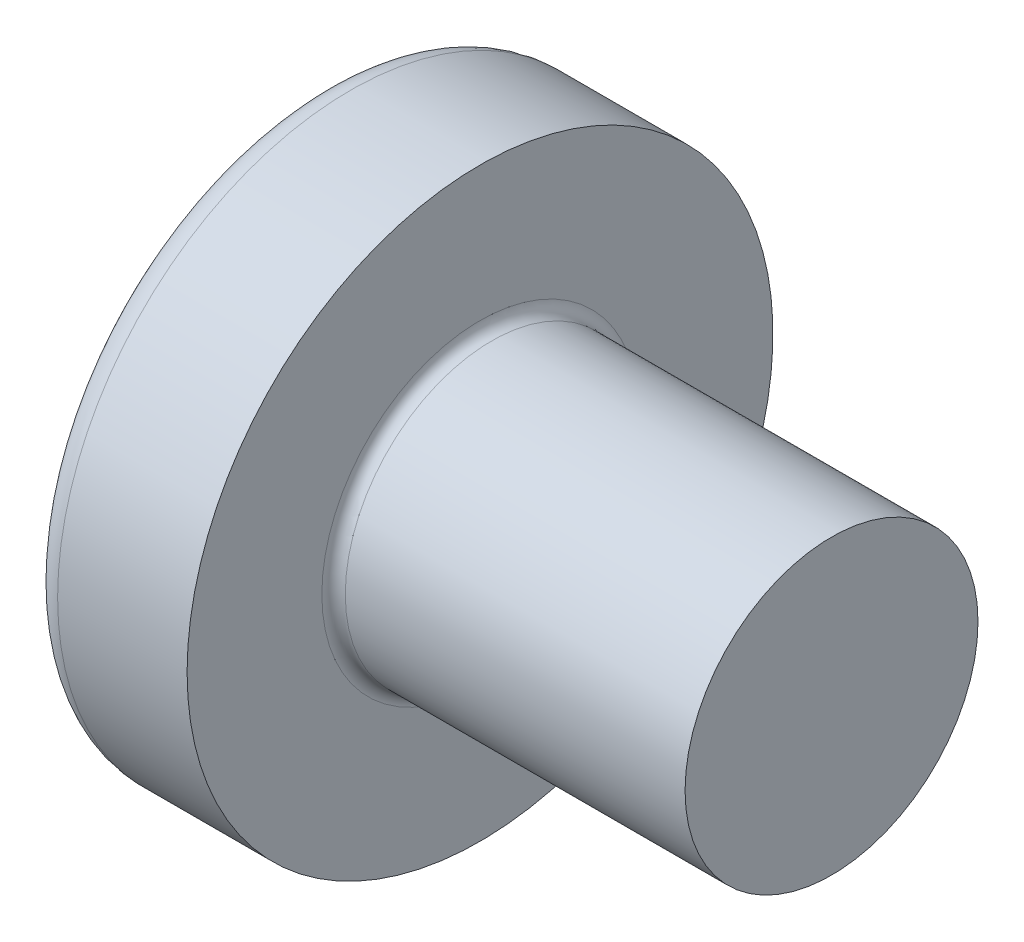
ISO-10303-21;
HEADER;
FILE_DESCRIPTION(('STEP AP214'),'2;1');
FILE_NAME('part.step','',(''),(''),'','','');
FILE_SCHEMA(('AUTOMOTIVE_DESIGN { 1 0 10303 214 1 1 1 1 }'));
ENDSEC;
DATA;
#1=APPLICATION_CONTEXT('core data for automotive mechanical design processes');
#2=APPLICATION_PROTOCOL_DEFINITION('international standard','automotive_design',2000,#1);
#3=PRODUCT_CONTEXT('',#1,'mechanical');
#4=PRODUCT('Part','Part','',(#3));
#5=PRODUCT_RELATED_PRODUCT_CATEGORY('part','',(#4));
#6=PRODUCT_DEFINITION_FORMATION('','',#4);
#7=PRODUCT_DEFINITION_CONTEXT('part definition',#1,'design');
#8=PRODUCT_DEFINITION('design','',#6,#7);
#9=PRODUCT_DEFINITION_SHAPE('','',#8);
#10=(LENGTH_UNIT() NAMED_UNIT(*) SI_UNIT(.MILLI.,.METRE.));
#11=(NAMED_UNIT(*) PLANE_ANGLE_UNIT() SI_UNIT($,.RADIAN.));
#12=(NAMED_UNIT(*) SI_UNIT($,.STERADIAN.) SOLID_ANGLE_UNIT());
#13=UNCERTAINTY_MEASURE_WITH_UNIT(LENGTH_MEASURE(1.E-05),#10,'distance_accuracy_value','');
#14=(GEOMETRIC_REPRESENTATION_CONTEXT(3) GLOBAL_UNCERTAINTY_ASSIGNED_CONTEXT((#13)) GLOBAL_UNIT_ASSIGNED_CONTEXT((#10,
#11,#12)) REPRESENTATION_CONTEXT('',''));
#15=CARTESIAN_POINT('',(0.,0.,0.));
#16=DIRECTION('',(0.,0.,1.));
#17=DIRECTION('',(1.,0.,0.));
#18=AXIS2_PLACEMENT_3D('',#15,#16,#17);
#19=CARTESIAN_POINT('',(4.,0.,0.));
#20=DIRECTION('',(-1.,0.,0.));
#21=DIRECTION('',(0.,1.,0.));
#22=AXIS2_PLACEMENT_3D('',#19,#20,#21);
#23=SPHERICAL_SURFACE('',#22,4.);
#24=CARTESIAN_POINT('',(0.803195914613464,0.,0.));
#25=DIRECTION('',(-1.,0.,0.));
#26=DIRECTION('',(0.,0.,1.));
#27=AXIS2_PLACEMENT_3D('',#24,#25,#26);
#28=CIRCLE('',#27,2.40425531914894);
#29=CARTESIAN_POINT('',(0.803195914613464,0.,2.40425531914894));
#30=VERTEX_POINT('',#29);
#31=EDGE_CURVE('E238',#30,#30,#28,.T.);
#32=ORIENTED_EDGE('',*,*,#31,.T.);
#33=EDGE_LOOP('',(#32));
#34=FACE_BOUND('',#33,.T.);
#35=CARTESIAN_POINT('',(0.0543400780062932,0.,0.));
#36=DIRECTION('',(1.,0.,0.));
#37=DIRECTION('',(0.,0.,-1.));
#38=AXIS2_PLACEMENT_3D('',#35,#36,#37);
#39=CIRCLE('',#38,0.657090389499513);
#40=CARTESIAN_POINT('',(0.0543400780062942,-0.369999999999998,-0.54301729251712));
#41=VERTEX_POINT('',#40);
#42=CARTESIAN_POINT('',(0.0543400780062936,-0.543017292517118,-0.37));
#43=VERTEX_POINT('',#42);
#44=EDGE_CURVE('E374',#41,#43,#39,.F.);
#45=ORIENTED_EDGE('',*,*,#44,.F.);
#46=CARTESIAN_POINT('',(4.,-0.37,0.));
#47=DIRECTION('',(0.,1.,0.));
#48=DIRECTION('',(0.,0.,1.));
#49=AXIS2_PLACEMENT_3D('',#46,#47,#48);
#50=CIRCLE('',#49,3.98285073785097);
#51=CARTESIAN_POINT('',(0.201999111211585,-0.369999999999996,-1.19928697514915));
#52=VERTEX_POINT('',#51);
#53=EDGE_CURVE('E300',#52,#41,#50,.T.);
#54=ORIENTED_EDGE('',*,*,#53,.F.);
#55=CARTESIAN_POINT('',(3.72274328891674,0.,0.556091024961349));
#56=DIRECTION('',(0.446197753347436,0.,-0.894934391398443));
#57=DIRECTION('',(-0.894934391398443,0.,-0.446197753347436));
#58=AXIS2_PLACEMENT_3D('',#55,#56,#57);
#59=CIRCLE('',#58,3.95144169742092);
#60=CARTESIAN_POINT('',(0.201999111211585,0.370000000000004,-1.19928697514915));
#61=VERTEX_POINT('',#60);
#62=EDGE_CURVE('E272',#52,#61,#59,.T.);
#63=ORIENTED_EDGE('',*,*,#62,.T.);
#64=CARTESIAN_POINT('',(4.,0.37,0.));
#65=DIRECTION('',(0.,-1.,0.));
#66=DIRECTION('',(0.,0.,-1.));
#67=AXIS2_PLACEMENT_3D('',#64,#65,#66);
#68=CIRCLE('',#67,3.98285073785097);
#69=CARTESIAN_POINT('',(0.0543400780062935,0.370000000000002,-0.543017292517118));
#70=VERTEX_POINT('',#69);
#71=EDGE_CURVE('E327',#70,#61,#68,.T.);
#72=ORIENTED_EDGE('',*,*,#71,.F.);
#73=CARTESIAN_POINT('',(0.0543400780062936,0.543017292517118,-0.37));
#74=VERTEX_POINT('',#73);
#75=EDGE_CURVE('E393',#74,#70,#39,.F.);
#76=ORIENTED_EDGE('',*,*,#75,.F.);
#77=CARTESIAN_POINT('',(4.,0.,-0.37));
#78=DIRECTION('',(0.,0.,1.));
#79=DIRECTION('',(1.,0.,0.));
#80=AXIS2_PLACEMENT_3D('',#77,#78,#79);
#81=CIRCLE('',#80,3.98285073785097);
#82=CARTESIAN_POINT('',(0.201999111211585,1.19928697514915,-0.37));
#83=VERTEX_POINT('',#82);
#84=EDGE_CURVE('E266',#83,#74,#81,.T.);
#85=ORIENTED_EDGE('',*,*,#84,.F.);
#86=CARTESIAN_POINT('',(3.72274328891674,-0.556091024961349,0.));
#87=DIRECTION('',(0.446197753347436,0.894934391398443,0.));
#88=DIRECTION('',(-0.894934391398443,0.446197753347436,0.));
#89=AXIS2_PLACEMENT_3D('',#86,#87,#88);
#90=CIRCLE('',#89,3.95144169742092);
#91=CARTESIAN_POINT('',(0.201999111211584,1.19928697514915,0.37));
#92=VERTEX_POINT('',#91);
#93=EDGE_CURVE('E269',#83,#92,#90,.T.);
#94=ORIENTED_EDGE('',*,*,#93,.T.);
#95=CARTESIAN_POINT('',(4.,0.,0.37));
#96=DIRECTION('',(0.,0.,-1.));
#97=DIRECTION('',(0.,1.,0.));
#98=AXIS2_PLACEMENT_3D('',#95,#96,#97);
#99=CIRCLE('',#98,3.98285073785097);
#100=CARTESIAN_POINT('',(0.0543400780062936,0.543017292517118,0.37));
#101=VERTEX_POINT('',#100);
#102=EDGE_CURVE('E262',#101,#92,#99,.T.);
#103=ORIENTED_EDGE('',*,*,#102,.F.);
#104=CARTESIAN_POINT('',(0.0543400780062942,0.369999999999998,0.54301729251712));
#105=VERTEX_POINT('',#104);
#106=EDGE_CURVE('E392',#105,#101,#39,.F.);
#107=ORIENTED_EDGE('',*,*,#106,.F.);
#108=CARTESIAN_POINT('',(0.201999111211585,0.369999999999996,1.19928697514916));
#109=VERTEX_POINT('',#108);
#110=EDGE_CURVE('E282',#109,#105,#68,.T.);
#111=ORIENTED_EDGE('',*,*,#110,.F.);
#112=CARTESIAN_POINT('',(3.72274328891674,0.,-0.556091024961349));
#113=DIRECTION('',(0.446197753347436,0.,0.894934391398443));
#114=DIRECTION('',(0.894934391398443,0.,-0.446197753347436));
#115=AXIS2_PLACEMENT_3D('',#112,#113,#114);
#116=CIRCLE('',#115,3.95144169742092);
#117=CARTESIAN_POINT('',(0.201999111211584,-0.370000000000004,1.19928697514915));
#118=VERTEX_POINT('',#117);
#119=EDGE_CURVE('E49',#109,#118,#116,.T.);
#120=ORIENTED_EDGE('',*,*,#119,.T.);
#121=CARTESIAN_POINT('',(0.0543400780062934,-0.370000000000002,0.543017292517118));
#122=VERTEX_POINT('',#121);
#123=EDGE_CURVE('E279',#122,#118,#50,.T.);
#124=ORIENTED_EDGE('',*,*,#123,.F.);
#125=CARTESIAN_POINT('',(0.0543400780062936,-0.543017292517118,0.37));
#126=VERTEX_POINT('',#125);
#127=EDGE_CURVE('E428',#126,#122,#39,.F.);
#128=ORIENTED_EDGE('',*,*,#127,.F.);
#129=CARTESIAN_POINT('',(0.201999111211585,-1.19928697514915,0.37));
#130=VERTEX_POINT('',#129);
#131=EDGE_CURVE('E263',#130,#126,#99,.T.);
#132=ORIENTED_EDGE('',*,*,#131,.F.);
#133=CARTESIAN_POINT('',(3.72274328891674,0.556091024961349,0.));
#134=DIRECTION('',(0.446197753347436,-0.894934391398443,0.));
#135=DIRECTION('',(0.894934391398443,0.446197753347436,0.));
#136=AXIS2_PLACEMENT_3D('',#133,#134,#135);
#137=CIRCLE('',#136,3.95144169742092);
#138=CARTESIAN_POINT('',(0.201999111211585,-1.19928697514915,-0.37));
#139=VERTEX_POINT('',#138);
#140=EDGE_CURVE('E259',#130,#139,#137,.T.);
#141=ORIENTED_EDGE('',*,*,#140,.T.);
#142=EDGE_CURVE('E64',#43,#139,#81,.T.);
#143=ORIENTED_EDGE('',*,*,#142,.F.);
#144=EDGE_LOOP('',(#45,#54,#63,#72,#76,#85,#94,#103,#107,#111,#120,#124,#128,#132,#141,#143));
#145=FACE_BOUND('',#144,.T.);
#146=ADVANCED_FACE('F36',(#34,#145),#23,.T.);
#147=CARTESIAN_POINT('',(1.5,0.552127712987656,-0.37));
#148=DIRECTION('',(0.,0.,1.));
#149=DIRECTION('',(1.,0.,0.));
#150=AXIS2_PLACEMENT_3D('',#147,#148,#149);
#151=PLANE('',#150);
#152=ORIENTED_EDGE('',*,*,#84,.T.);
#153=CARTESIAN_POINT('',(-0.98410748766867,0.628943903399942,-0.37));
#154=CARTESIAN_POINT('',(-0.783603343008974,0.612669947295736,-0.37));
#155=CARTESIAN_POINT('',(-0.583110931104086,0.596248129681141,-0.37));
#156=CARTESIAN_POINT('',(-0.182155788452109,0.562989164841715,-0.37));
#157=CARTESIAN_POINT('',(0.0183069414735531,0.546152007726029,-0.37));
#158=CARTESIAN_POINT('',(0.419186928470486,0.511943523152247,-0.37));
#159=CARTESIAN_POINT('',(0.61960418554543,0.4945721957373,-0.37));
#160=CARTESIAN_POINT('',(1.02037173794706,0.459102589125901,-0.37));
#161=CARTESIAN_POINT('',(1.22072203423871,0.441004320904958,-0.37));
#162=CARTESIAN_POINT('',(1.53631168775258,0.411665443099266,-0.37));
#163=CARTESIAN_POINT('',(1.65158348734209,0.400774467003839,-0.37));
#164=CARTESIAN_POINT('',(1.88208360561815,0.378547148308018,-0.37));
#165=CARTESIAN_POINT('',(1.99731192452822,0.367210808029326,-0.37));
#166=CARTESIAN_POINT('',(2.22771614129237,0.343963614894723,-0.37));
#167=CARTESIAN_POINT('',(2.34289203669079,0.332052737461392,-0.37));
#168=CARTESIAN_POINT('',(2.5731581934851,0.30741320876737,-0.37));
#169=CARTESIAN_POINT('',(2.68824845325022,0.294684542317204,-0.37));
#170=CARTESIAN_POINT('',(2.80327961663798,0.281425340988554,-0.37));
#171=B_SPLINE_CURVE_WITH_KNOTS('',3,(#153,#154,#155,#156,#157,#158,#159,#160,#161,#162,#163,
#164,#165,#166,#167,#168,#169,#170),.UNSPECIFIED.,.F.,.F.,(4,2,2,2,2,2,2,2,4),(0.,
0.603490856265068,1.20699609790343,1.81050129079257,2.41399737525255,2.7613521432415,
3.1087051006963,3.45607293033825,3.80344721379854),.UNSPECIFIED.);
#172=CARTESIAN_POINT('',(1.5,0.415013252800437,-0.370000000000001));
#173=VERTEX_POINT('',#172);
#174=EDGE_CURVE('E414',#74,#173,#171,.T.);
#175=ORIENTED_EDGE('',*,*,#174,.T.);
#176=DIRECTION('',(0.,1.,0.));
#177=VECTOR('',#176,1.);
#178=CARTESIAN_POINT('',(1.5,-0.552127712987656,-0.37));
#179=LINE('',#178,#177);
#180=CARTESIAN_POINT('',(1.5,0.552127712987656,-0.37));
#181=VERTEX_POINT('',#180);
#182=EDGE_CURVE('E356',#173,#181,#179,.T.);
#183=ORIENTED_EDGE('',*,*,#182,.T.);
#184=DIRECTION('',(0.894934391398443,-0.446197753347436,0.));
#185=VECTOR('',#184,1.);
#186=CARTESIAN_POINT('',(0.,1.3,-0.37));
#187=LINE('',#186,#185);
#188=EDGE_CURVE('E239',#83,#181,#187,.T.);
#189=ORIENTED_EDGE('',*,*,#188,.F.);
#190=EDGE_LOOP('',(#152,#175,#183,#189));
#191=FACE_BOUND('',#190,.T.);
#192=ADVANCED_FACE('F194',(#191),#151,.T.);
#193=CARTESIAN_POINT('',(1.5,-0.552127712987656,-0.37));
#194=VERTEX_POINT('',#193);
#195=CARTESIAN_POINT('',(1.5,-0.415013252800437,-0.370000000000001));
#196=VERTEX_POINT('',#195);
#197=EDGE_CURVE('E247',#194,#196,#179,.T.);
#198=ORIENTED_EDGE('',*,*,#197,.T.);
#199=CARTESIAN_POINT('',(-0.98410748766867,-0.628943903399942,-0.37));
#200=CARTESIAN_POINT('',(-0.783603343008975,-0.612669947295736,-0.37));
#201=CARTESIAN_POINT('',(-0.583110931104087,-0.596248129681141,-0.37));
#202=CARTESIAN_POINT('',(-0.182155788452109,-0.562989164841715,-0.37));
#203=CARTESIAN_POINT('',(0.0183069414735522,-0.546152007726029,-0.37));
#204=CARTESIAN_POINT('',(0.419186928470486,-0.511943523152247,-0.37));
#205=CARTESIAN_POINT('',(0.619604185545429,-0.4945721957373,-0.37));
#206=CARTESIAN_POINT('',(1.02037173794705,-0.459102589125901,-0.37));
#207=CARTESIAN_POINT('',(1.22072203423871,-0.441004320904958,-0.37));
#208=CARTESIAN_POINT('',(1.53631168775258,-0.411665443099266,-0.37));
#209=CARTESIAN_POINT('',(1.65158348734209,-0.400774467003839,-0.37));
#210=CARTESIAN_POINT('',(1.88208360561815,-0.378547148308018,-0.37));
#211=CARTESIAN_POINT('',(1.99731192452822,-0.367210808029326,-0.37));
#212=CARTESIAN_POINT('',(2.22771614129237,-0.343963614894723,-0.37));
#213=CARTESIAN_POINT('',(2.34289203669079,-0.332052737461392,-0.37));
#214=CARTESIAN_POINT('',(2.5731581934851,-0.30741320876737,-0.37));
#215=CARTESIAN_POINT('',(2.68824845325022,-0.294684542317204,-0.37));
#216=CARTESIAN_POINT('',(2.80327961663798,-0.281425340988554,-0.37));
#217=B_SPLINE_CURVE_WITH_KNOTS('',3,(#199,#200,#201,#202,#203,#204,#205,#206,#207,#208,#209,
#210,#211,#212,#213,#214,#215,#216),.UNSPECIFIED.,.F.,.F.,(4,2,2,2,2,2,2,2,4),(0.,
0.603490856265068,1.20699609790343,1.81050129079257,2.41399737525255,2.7613521432415,
3.1087051006963,3.45607293033825,3.80344721379854),.UNSPECIFIED.);
#218=EDGE_CURVE('E391',#196,#43,#217,.F.);
#219=ORIENTED_EDGE('',*,*,#218,.T.);
#220=ORIENTED_EDGE('',*,*,#142,.T.);
#221=DIRECTION('',(0.894934391398443,0.446197753347436,0.));
#222=VECTOR('',#221,1.);
#223=CARTESIAN_POINT('',(0.,-1.3,-0.37));
#224=LINE('',#223,#222);
#225=EDGE_CURVE('E330',#139,#194,#224,.T.);
#226=ORIENTED_EDGE('',*,*,#225,.T.);
#227=EDGE_LOOP('',(#198,#219,#220,#226));
#228=FACE_BOUND('',#227,.T.);
#229=ADVANCED_FACE('F200',(#228),#151,.T.);
#230=CARTESIAN_POINT('',(1.5,-0.552127712987656,0.37));
#231=DIRECTION('',(0.,0.,-1.));
#232=DIRECTION('',(0.,1.,0.));
#233=AXIS2_PLACEMENT_3D('',#230,#231,#232);
#234=PLANE('',#233);
#235=DIRECTION('',(0.,-1.,0.));
#236=VECTOR('',#235,1.);
#237=CARTESIAN_POINT('',(1.5,0.552127712987656,0.37));
#238=LINE('',#237,#236);
#239=CARTESIAN_POINT('',(1.5,0.552127712987655,0.37));
#240=VERTEX_POINT('',#239);
#241=CARTESIAN_POINT('',(1.5,0.415013252800437,0.370000000000001));
#242=VERTEX_POINT('',#241);
#243=EDGE_CURVE('E339',#240,#242,#238,.T.);
#244=ORIENTED_EDGE('',*,*,#243,.T.);
#245=CARTESIAN_POINT('',(-0.98410748766867,0.628943903399942,0.37));
#246=CARTESIAN_POINT('',(-0.783603343008974,0.612669947295736,0.37));
#247=CARTESIAN_POINT('',(-0.583110931104087,0.596248129681141,0.37));
#248=CARTESIAN_POINT('',(-0.182155788452109,0.562989164841715,0.37));
#249=CARTESIAN_POINT('',(0.0183069414735524,0.546152007726029,0.37));
#250=CARTESIAN_POINT('',(0.419186928470486,0.511943523152247,0.37));
#251=CARTESIAN_POINT('',(0.619604185545429,0.4945721957373,0.37));
#252=CARTESIAN_POINT('',(1.02037173794705,0.459102589125901,0.37));
#253=CARTESIAN_POINT('',(1.22072203423871,0.441004320904958,0.37));
#254=CARTESIAN_POINT('',(1.53631168775258,0.411665443099266,0.37));
#255=CARTESIAN_POINT('',(1.65158348734209,0.400774467003839,0.37));
#256=CARTESIAN_POINT('',(1.88208360561815,0.378547148308018,0.37));
#257=CARTESIAN_POINT('',(1.99731192452822,0.367210808029326,0.37));
#258=CARTESIAN_POINT('',(2.22771614129237,0.343963614894723,0.37));
#259=CARTESIAN_POINT('',(2.34289203669079,0.332052737461392,0.37));
#260=CARTESIAN_POINT('',(2.5731581934851,0.30741320876737,0.37));
#261=CARTESIAN_POINT('',(2.68824845325022,0.294684542317204,0.37));
#262=CARTESIAN_POINT('',(2.80327961663798,0.281425340988554,0.37));
#263=B_SPLINE_CURVE_WITH_KNOTS('',3,(#245,#246,#247,#248,#249,#250,#251,#252,#253,#254,#255,
#256,#257,#258,#259,#260,#261,#262),.UNSPECIFIED.,.F.,.F.,(4,2,2,2,2,2,2,2,4),(0.,
0.603490856265068,1.20699609790343,1.81050129079257,2.41399737525255,2.7613521432415,
3.1087051006963,3.45607293033825,3.80344721379855),.UNSPECIFIED.);
#264=EDGE_CURVE('E666',#242,#101,#263,.F.);
#265=ORIENTED_EDGE('',*,*,#264,.T.);
#266=ORIENTED_EDGE('',*,*,#102,.T.);
#267=DIRECTION('',(0.894934391398443,-0.446197753347436,0.));
#268=VECTOR('',#267,1.);
#269=CARTESIAN_POINT('',(0.,1.3,0.37));
#270=LINE('',#269,#268);
#271=EDGE_CURVE('E244',#92,#240,#270,.T.);
#272=ORIENTED_EDGE('',*,*,#271,.T.);
#273=EDGE_LOOP('',(#244,#265,#266,#272));
#274=FACE_BOUND('',#273,.T.);
#275=ADVANCED_FACE('F410',(#274),#234,.T.);
#276=ORIENTED_EDGE('',*,*,#131,.T.);
#277=CARTESIAN_POINT('',(-0.98410748766867,-0.628943903399942,0.37));
#278=CARTESIAN_POINT('',(-0.783603343008974,-0.612669947295736,0.37));
#279=CARTESIAN_POINT('',(-0.583110931104086,-0.596248129681141,0.37));
#280=CARTESIAN_POINT('',(-0.182155788452109,-0.562989164841715,0.37));
#281=CARTESIAN_POINT('',(0.0183069414735529,-0.546152007726029,0.37));
#282=CARTESIAN_POINT('',(0.419186928470486,-0.511943523152247,0.37));
#283=CARTESIAN_POINT('',(0.61960418554543,-0.4945721957373,0.37));
#284=CARTESIAN_POINT('',(1.02037173794706,-0.459102589125901,0.37));
#285=CARTESIAN_POINT('',(1.22072203423871,-0.441004320904958,0.37));
#286=CARTESIAN_POINT('',(1.53631168775258,-0.411665443099266,0.37));
#287=CARTESIAN_POINT('',(1.65158348734209,-0.400774467003839,0.37));
#288=CARTESIAN_POINT('',(1.88208360561815,-0.378547148308018,0.37));
#289=CARTESIAN_POINT('',(1.99731192452822,-0.367210808029326,0.37));
#290=CARTESIAN_POINT('',(2.22771614129237,-0.343963614894723,0.37));
#291=CARTESIAN_POINT('',(2.34289203669079,-0.332052737461392,0.37));
#292=CARTESIAN_POINT('',(2.5731581934851,-0.307413208767371,0.37));
#293=CARTESIAN_POINT('',(2.68824845325022,-0.294684542317204,0.37));
#294=CARTESIAN_POINT('',(2.80327961663798,-0.281425340988554,0.37));
#295=B_SPLINE_CURVE_WITH_KNOTS('',3,(#277,#278,#279,#280,#281,#282,#283,#284,#285,#286,#287,
#288,#289,#290,#291,#292,#293,#294),.UNSPECIFIED.,.F.,.F.,(4,2,2,2,2,2,2,2,4),(0.,
0.603490856265068,1.20699609790343,1.81050129079257,2.41399737525255,2.7613521432415,
3.1087051006963,3.45607293033825,3.80344721379854),.UNSPECIFIED.);
#296=CARTESIAN_POINT('',(1.5,-0.415013252800437,0.370000000000001));
#297=VERTEX_POINT('',#296);
#298=EDGE_CURVE('E429',#126,#297,#295,.T.);
#299=ORIENTED_EDGE('',*,*,#298,.T.);
#300=CARTESIAN_POINT('',(1.5,-0.552127712987656,0.37));
#301=VERTEX_POINT('',#300);
#302=EDGE_CURVE('E341',#297,#301,#238,.T.);
#303=ORIENTED_EDGE('',*,*,#302,.T.);
#304=DIRECTION('',(0.894934391398443,0.446197753347436,0.));
#305=VECTOR('',#304,1.);
#306=CARTESIAN_POINT('',(0.,-1.3,0.37));
#307=LINE('',#306,#305);
#308=EDGE_CURVE('E332',#130,#301,#307,.T.);
#309=ORIENTED_EDGE('',*,*,#308,.F.);
#310=EDGE_LOOP('',(#276,#299,#303,#309));
#311=FACE_BOUND('',#310,.T.);
#312=ADVANCED_FACE('F514',(#311),#234,.T.);
#313=CARTESIAN_POINT('',(0.,1.3,0.37));
#314=DIRECTION('',(0.446197753347436,0.894934391398443,0.));
#315=DIRECTION('',(-0.894934391398443,0.446197753347436,0.));
#316=AXIS2_PLACEMENT_3D('',#313,#314,#315);
#317=PLANE('',#316);
#318=CARTESIAN_POINT('',(2.47007552564217,0.0684659783631794,0.));
#319=DIRECTION('',(0.446197753347436,0.894934391398443,0.));
#320=DIRECTION('',(-0.894934391398443,0.446197753347436,0.));
#321=AXIS2_PLACEMENT_3D('',#318,#319,#320);
#322=ELLIPSE('',#321,1.0940568559235,0.483340636970288);
#323=CARTESIAN_POINT('',(1.5,0.552127712987657,0.0655056375514307));
#324=VERTEX_POINT('',#323);
#325=CARTESIAN_POINT('',(1.5,0.552127712987657,-0.0655056375514305));
#326=VERTEX_POINT('',#325);
#327=EDGE_CURVE('E305',#324,#326,#322,.F.);
#328=ORIENTED_EDGE('',*,*,#327,.F.);
#329=DIRECTION('',(0.,0.,-1.));
#330=VECTOR('',#329,1.);
#331=CARTESIAN_POINT('',(1.5,0.552127712987656,0.37));
#332=LINE('',#331,#330);
#333=EDGE_CURVE('E342',#240,#324,#332,.T.);
#334=ORIENTED_EDGE('',*,*,#333,.F.);
#335=ORIENTED_EDGE('',*,*,#271,.F.);
#336=ORIENTED_EDGE('',*,*,#93,.F.);
#337=ORIENTED_EDGE('',*,*,#188,.T.);
#338=EDGE_CURVE('E344',#326,#181,#332,.T.);
#339=ORIENTED_EDGE('',*,*,#338,.F.);
#340=EDGE_LOOP('',(#328,#334,#335,#336,#337,#339));
#341=FACE_BOUND('',#340,.T.);
#342=ADVANCED_FACE('F408',(#341),#317,.F.);
#343=CARTESIAN_POINT('',(0.,-1.3,-0.37));
#344=DIRECTION('',(0.446197753347436,-0.894934391398443,0.));
#345=DIRECTION('',(0.894934391398443,0.446197753347436,0.));
#346=AXIS2_PLACEMENT_3D('',#343,#344,#345);
#347=PLANE('',#346);
#348=CARTESIAN_POINT('',(2.47007552564217,-0.0684659783631794,0.));
#349=DIRECTION('',(0.446197753347436,-0.894934391398443,0.));
#350=DIRECTION('',(-0.894934391398443,-0.446197753347436,0.));
#351=AXIS2_PLACEMENT_3D('',#348,#349,#350);
#352=ELLIPSE('',#351,1.0940568559235,0.483340636970288);
#353=CARTESIAN_POINT('',(1.5,-0.552127712987657,-0.0655056375514327));
#354=VERTEX_POINT('',#353);
#355=CARTESIAN_POINT('',(1.5,-0.552127712987657,0.0655056375514325));
#356=VERTEX_POINT('',#355);
#357=EDGE_CURVE('E668',#354,#356,#352,.F.);
#358=ORIENTED_EDGE('',*,*,#357,.F.);
#359=DIRECTION('',(0.,0.,1.));
#360=VECTOR('',#359,1.);
#361=CARTESIAN_POINT('',(1.5,-0.552127712987656,-0.37));
#362=LINE('',#361,#360);
#363=EDGE_CURVE('E335',#194,#354,#362,.T.);
#364=ORIENTED_EDGE('',*,*,#363,.F.);
#365=ORIENTED_EDGE('',*,*,#225,.F.);
#366=ORIENTED_EDGE('',*,*,#140,.F.);
#367=ORIENTED_EDGE('',*,*,#308,.T.);
#368=EDGE_CURVE('E338',#356,#301,#362,.T.);
#369=ORIENTED_EDGE('',*,*,#368,.F.);
#370=EDGE_LOOP('',(#358,#364,#365,#366,#367,#369));
#371=FACE_BOUND('',#370,.T.);
#372=ADVANCED_FACE('F501',(#371),#347,.F.);
#373=CARTESIAN_POINT('',(1.5,0.552127712987656,-0.37));
#374=DIRECTION('',(-1.,0.,0.));
#375=DIRECTION('',(0.,0.,1.));
#376=AXIS2_PLACEMENT_3D('',#373,#374,#375);
#377=PLANE('',#376);
#378=DIRECTION('',(0.,1.,0.));
#379=VECTOR('',#378,1.);
#380=CARTESIAN_POINT('',(1.5,-0.370000000000002,0.552127712987654));
#381=LINE('',#380,#379);
#382=CARTESIAN_POINT('',(1.5,-0.370000000000002,0.552127712987654));
#383=VERTEX_POINT('',#382);
#384=CARTESIAN_POINT('',(1.5,-0.0655056375514436,0.552127712987656));
#385=VERTEX_POINT('',#384);
#386=EDGE_CURVE('E320',#383,#385,#381,.T.);
#387=ORIENTED_EDGE('',*,*,#386,.T.);
#388=CARTESIAN_POINT('',(1.5,0.,0.));
#389=DIRECTION('',(-1.,0.,0.));
#390=DIRECTION('',(0.,0.,1.));
#391=AXIS2_PLACEMENT_3D('',#388,#389,#390);
#392=CIRCLE('',#391,0.556);
#393=CARTESIAN_POINT('',(1.5,-0.370000000000001,0.415013252800436));
#394=VERTEX_POINT('',#393);
#395=EDGE_CURVE('E694',#394,#385,#392,.T.);
#396=ORIENTED_EDGE('',*,*,#395,.F.);
#397=DIRECTION('',(0.,0.,-1.));
#398=VECTOR('',#397,1.);
#399=CARTESIAN_POINT('',(1.5,-0.370000000000002,0.552127712987654));
#400=LINE('',#399,#398);
#401=EDGE_CURVE('E316',#383,#394,#400,.T.);
#402=ORIENTED_EDGE('',*,*,#401,.F.);
#403=EDGE_LOOP('',(#387,#396,#402));
#404=FACE_BOUND('',#403,.T.);
#405=ADVANCED_FACE('F494',(#404),#377,.T.);
#406=ORIENTED_EDGE('',*,*,#302,.F.);
#407=EDGE_CURVE('E699',#356,#297,#392,.T.);
#408=ORIENTED_EDGE('',*,*,#407,.F.);
#409=ORIENTED_EDGE('',*,*,#368,.T.);
#410=EDGE_LOOP('',(#406,#408,#409));
#411=FACE_BOUND('',#410,.T.);
#412=ADVANCED_FACE('F487',(#411),#377,.T.);
#413=ORIENTED_EDGE('',*,*,#363,.T.);
#414=EDGE_CURVE('E385',#196,#354,#392,.T.);
#415=ORIENTED_EDGE('',*,*,#414,.F.);
#416=ORIENTED_EDGE('',*,*,#197,.F.);
#417=EDGE_LOOP('',(#413,#415,#416));
#418=FACE_BOUND('',#417,.T.);
#419=ADVANCED_FACE('F481',(#418),#377,.T.);
#420=CARTESIAN_POINT('',(1.5,-0.369999999999998,-0.415013252800437));
#421=VERTEX_POINT('',#420);
#422=CARTESIAN_POINT('',(1.5,-0.369999999999998,-0.552127712987657));
#423=VERTEX_POINT('',#422);
#424=EDGE_CURVE('E319',#421,#423,#400,.T.);
#425=ORIENTED_EDGE('',*,*,#424,.F.);
#426=CARTESIAN_POINT('',(1.5,-0.0655056375514398,-0.552127712987656));
#427=VERTEX_POINT('',#426);
#428=EDGE_CURVE('E56',#427,#421,#392,.T.);
#429=ORIENTED_EDGE('',*,*,#428,.F.);
#430=DIRECTION('',(0.,-1.,0.));
#431=VECTOR('',#430,1.);
#432=CARTESIAN_POINT('',(1.5,0.370000000000002,-0.552127712987654));
#433=LINE('',#432,#431);
#434=EDGE_CURVE('E315',#427,#423,#433,.T.);
#435=ORIENTED_EDGE('',*,*,#434,.T.);
#436=EDGE_LOOP('',(#425,#429,#435));
#437=FACE_BOUND('',#436,.T.);
#438=ADVANCED_FACE('F380',(#437),#377,.T.);
#439=CARTESIAN_POINT('',(1.5,0.370000000000002,-0.552127712987654));
#440=VERTEX_POINT('',#439);
#441=CARTESIAN_POINT('',(1.5,0.0655056375514436,-0.552127712987656));
#442=VERTEX_POINT('',#441);
#443=EDGE_CURVE('E312',#440,#442,#433,.T.);
#444=ORIENTED_EDGE('',*,*,#443,.T.);
#445=CARTESIAN_POINT('',(1.5,0.370000000000001,-0.415013252800436));
#446=VERTEX_POINT('',#445);
#447=EDGE_CURVE('E384',#446,#442,#392,.T.);
#448=ORIENTED_EDGE('',*,*,#447,.F.);
#449=DIRECTION('',(0.,0.,1.));
#450=VECTOR('',#449,1.);
#451=CARTESIAN_POINT('',(1.5,0.370000000000002,-0.552127712987654));
#452=LINE('',#451,#450);
#453=EDGE_CURVE('E324',#440,#446,#452,.T.);
#454=ORIENTED_EDGE('',*,*,#453,.F.);
#455=EDGE_LOOP('',(#444,#448,#454));
#456=FACE_BOUND('',#455,.T.);
#457=ADVANCED_FACE('F469',(#456),#377,.T.);
#458=ORIENTED_EDGE('',*,*,#182,.F.);
#459=EDGE_CURVE('E683',#326,#173,#392,.T.);
#460=ORIENTED_EDGE('',*,*,#459,.F.);
#461=ORIENTED_EDGE('',*,*,#338,.T.);
#462=EDGE_LOOP('',(#458,#460,#461));
#463=FACE_BOUND('',#462,.T.);
#464=ADVANCED_FACE('F462',(#463),#377,.T.);
#465=ORIENTED_EDGE('',*,*,#333,.T.);
#466=EDGE_CURVE('E685',#242,#324,#392,.T.);
#467=ORIENTED_EDGE('',*,*,#466,.F.);
#468=ORIENTED_EDGE('',*,*,#243,.F.);
#469=EDGE_LOOP('',(#465,#467,#468));
#470=FACE_BOUND('',#469,.T.);
#471=ADVANCED_FACE('F456',(#470),#377,.T.);
#472=CARTESIAN_POINT('',(1.5,0.369999999999998,0.552127712987657));
#473=DIRECTION('',(0.,-1.,0.));
#474=DIRECTION('',(1.,0.,0.));
#475=AXIS2_PLACEMENT_3D('',#472,#473,#474);
#476=PLANE('',#475);
#477=ORIENTED_EDGE('',*,*,#110,.T.);
#478=CARTESIAN_POINT('',(-0.984107487670368,0.369999999999998,0.628943903400081));
#479=CARTESIAN_POINT('',(-0.783603343010498,0.369999999999998,0.612669947295862));
#480=CARTESIAN_POINT('',(-0.583110931105436,0.369999999999998,0.596248129681253));
#481=CARTESIAN_POINT('',(-0.18215578845311,0.369999999999998,0.5629891648418));
#482=CARTESIAN_POINT('',(0.0183069414727262,0.369999999999998,0.546152007726101));
#483=CARTESIAN_POINT('',(0.419186928470242,0.369999999999998,0.51194352315227));
#484=CARTESIAN_POINT('',(0.619604185545593,0.369999999999998,0.494572195737287));
#485=CARTESIAN_POINT('',(1.02037173794803,0.369999999999998,0.459102589125815));
#486=CARTESIAN_POINT('',(1.22072203424009,0.369999999999998,0.441004320904834));
#487=CARTESIAN_POINT('',(1.53631168775438,0.369999999999999,0.411665443099098));
#488=CARTESIAN_POINT('',(1.65158348734389,0.369999999999999,0.40077446700367));
#489=CARTESIAN_POINT('',(1.88208360561995,0.369999999999999,0.378547148307844));
#490=CARTESIAN_POINT('',(1.99731192453001,0.369999999999999,0.367210808029149));
#491=CARTESIAN_POINT('',(2.22771614129417,0.369999999999999,0.34396361489454));
#492=CARTESIAN_POINT('',(2.34289203669258,0.369999999999999,0.332052737461206));
#493=CARTESIAN_POINT('',(2.57315819348689,0.369999999999999,0.307413208767176));
#494=CARTESIAN_POINT('',(2.68824845325201,0.369999999999999,0.294684542317004));
#495=CARTESIAN_POINT('',(2.80327961663977,0.369999999999999,0.281425340988348));
#496=B_SPLINE_CURVE_WITH_KNOTS('',3,(#478,#479,#480,#481,#482,#483,#484,#485,#486,#487,#488,
#489,#490,#491,#492,#493,#494,#495),.UNSPECIFIED.,.F.,.F.,(4,2,2,2,2,2,2,2,4),(0.,
0.603490856265592,1.20699609790448,1.81050129079485,2.41399737525605,2.76135214324501,
3.1087051006998,3.45607293034176,3.80344721380205),.UNSPECIFIED.);
#497=CARTESIAN_POINT('',(1.5,0.369999999999999,0.415013252800439));
#498=VERTEX_POINT('',#497);
#499=EDGE_CURVE('E665',#105,#498,#496,.T.);
#500=ORIENTED_EDGE('',*,*,#499,.T.);
#501=CARTESIAN_POINT('',(1.5,0.369999999999998,0.552127712987657));
#502=VERTEX_POINT('',#501);
#503=EDGE_CURVE('E297',#498,#502,#452,.T.);
#504=ORIENTED_EDGE('',*,*,#503,.T.);
#505=DIRECTION('',(0.894934391398443,0.,-0.446197753347436));
#506=VECTOR('',#505,1.);
#507=CARTESIAN_POINT('',(0.,0.369999999999995,1.3));
#508=LINE('',#507,#506);
#509=EDGE_CURVE('E290',#109,#502,#508,.T.);
#510=ORIENTED_EDGE('',*,*,#509,.F.);
#511=EDGE_LOOP('',(#477,#500,#504,#510));
#512=FACE_BOUND('',#511,.T.);
#513=ADVANCED_FACE('F294',(#512),#476,.T.);
#514=CARTESIAN_POINT('',(1.5,-0.369999999999998,-0.552127712987657));
#515=DIRECTION('',(0.,1.,0.));
#516=DIRECTION('',(0.,0.,1.));
#517=AXIS2_PLACEMENT_3D('',#514,#515,#516);
#518=PLANE('',#517);
#519=ORIENTED_EDGE('',*,*,#401,.T.);
#520=CARTESIAN_POINT('',(-0.98410748766867,-0.370000000000002,0.62894390339994));
#521=CARTESIAN_POINT('',(-0.783603343008974,-0.370000000000002,0.612669947295734));
#522=CARTESIAN_POINT('',(-0.583110931104086,-0.370000000000002,0.59624812968114));
#523=CARTESIAN_POINT('',(-0.182155788452108,-0.370000000000002,0.562989164841714));
#524=CARTESIAN_POINT('',(0.0183069414735531,-0.370000000000002,0.546152007726028));
#525=CARTESIAN_POINT('',(0.419186928470486,-0.370000000000002,0.511943523152246));
#526=CARTESIAN_POINT('',(0.61960418554543,-0.370000000000002,0.494572195737299));
#527=CARTESIAN_POINT('',(1.02037173794706,-0.370000000000002,0.459102589125899));
#528=CARTESIAN_POINT('',(1.22072203423871,-0.370000000000001,0.441004320904957));
#529=CARTESIAN_POINT('',(1.53631168775258,-0.370000000000001,0.411665443099264));
#530=CARTESIAN_POINT('',(1.65158348734209,-0.370000000000001,0.400774467003838));
#531=CARTESIAN_POINT('',(1.88208360561815,-0.370000000000001,0.378547148308017));
#532=CARTESIAN_POINT('',(1.99731192452822,-0.370000000000001,0.367210808029324));
#533=CARTESIAN_POINT('',(2.22771614129237,-0.370000000000001,0.343963614894722));
#534=CARTESIAN_POINT('',(2.34289203669079,-0.370000000000001,0.33205273746139));
#535=CARTESIAN_POINT('',(2.5731581934851,-0.370000000000001,0.307413208767369));
#536=CARTESIAN_POINT('',(2.68824845325022,-0.370000000000001,0.294684542317202));
#537=CARTESIAN_POINT('',(2.80327961663798,-0.370000000000001,0.281425340988552));
#538=B_SPLINE_CURVE_WITH_KNOTS('',3,(#520,#521,#522,#523,#524,#525,#526,#527,#528,#529,#530,
#531,#532,#533,#534,#535,#536,#537),.UNSPECIFIED.,.F.,.F.,(4,2,2,2,2,2,2,2,4),(0.,
0.603490856265068,1.20699609790343,1.81050129079257,2.41399737525255,2.7613521432415,
3.1087051006963,3.45607293033825,3.80344721379854),.UNSPECIFIED.);
#539=EDGE_CURVE('E422',#394,#122,#538,.F.);
#540=ORIENTED_EDGE('',*,*,#539,.T.);
#541=ORIENTED_EDGE('',*,*,#123,.T.);
#542=DIRECTION('',(0.894934391398443,0.,-0.446197753347436));
#543=VECTOR('',#542,1.);
#544=CARTESIAN_POINT('',(0.,-0.370000000000005,1.3));
#545=LINE('',#544,#543);
#546=EDGE_CURVE('E292',#118,#383,#545,.T.);
#547=ORIENTED_EDGE('',*,*,#546,.T.);
#548=EDGE_LOOP('',(#519,#540,#541,#547));
#549=FACE_BOUND('',#548,.T.);
#550=ADVANCED_FACE('F229',(#549),#518,.T.);
#551=CARTESIAN_POINT('',(0.,-0.370000000000005,1.3));
#552=DIRECTION('',(0.446197753347436,0.,0.894934391398443));
#553=DIRECTION('',(-0.894934391398443,0.,0.446197753347436));
#554=AXIS2_PLACEMENT_3D('',#551,#552,#553);
#555=PLANE('',#554);
#556=CARTESIAN_POINT('',(2.47007552564217,0.,0.0684659783631795));
#557=DIRECTION('',(0.446197753347436,0.,0.894934391398443));
#558=DIRECTION('',(-0.894934391398443,0.,0.446197753347436));
#559=AXIS2_PLACEMENT_3D('',#556,#557,#558);
#560=ELLIPSE('',#559,1.0940568559235,0.483340636970288);
#561=CARTESIAN_POINT('',(1.5,0.0655056375514398,0.552127712987656));
#562=VERTEX_POINT('',#561);
#563=EDGE_CURVE('E420',#385,#562,#560,.F.);
#564=ORIENTED_EDGE('',*,*,#563,.F.);
#565=ORIENTED_EDGE('',*,*,#386,.F.);
#566=ORIENTED_EDGE('',*,*,#546,.F.);
#567=ORIENTED_EDGE('',*,*,#119,.F.);
#568=ORIENTED_EDGE('',*,*,#509,.T.);
#569=EDGE_CURVE('E323',#562,#502,#381,.T.);
#570=ORIENTED_EDGE('',*,*,#569,.F.);
#571=EDGE_LOOP('',(#564,#565,#566,#567,#568,#570));
#572=FACE_BOUND('',#571,.T.);
#573=ADVANCED_FACE('F288',(#572),#555,.F.);
#574=CARTESIAN_POINT('',(0.,0.370000000000005,-1.3));
#575=DIRECTION('',(0.446197753347436,0.,-0.894934391398443));
#576=DIRECTION('',(0.894934391398443,0.,0.446197753347436));
#577=AXIS2_PLACEMENT_3D('',#574,#575,#576);
#578=PLANE('',#577);
#579=CARTESIAN_POINT('',(2.47007552564217,0.,-0.0684659783631795));
#580=DIRECTION('',(0.446197753347436,0.,-0.894934391398443));
#581=DIRECTION('',(-0.894934391398443,0.,-0.446197753347436));
#582=AXIS2_PLACEMENT_3D('',#579,#580,#581);
#583=ELLIPSE('',#582,1.0940568559235,0.483340636970288);
#584=EDGE_CURVE('E378',#442,#427,#583,.F.);
#585=ORIENTED_EDGE('',*,*,#584,.F.);
#586=ORIENTED_EDGE('',*,*,#443,.F.);
#587=DIRECTION('',(0.894934391398443,0.,0.446197753347436));
#588=VECTOR('',#587,1.);
#589=CARTESIAN_POINT('',(0.,0.370000000000005,-1.3));
#590=LINE('',#589,#588);
#591=EDGE_CURVE('E302',#61,#440,#590,.T.);
#592=ORIENTED_EDGE('',*,*,#591,.F.);
#593=ORIENTED_EDGE('',*,*,#62,.F.);
#594=DIRECTION('',(0.894934391398443,0.,0.446197753347436));
#595=VECTOR('',#594,1.);
#596=CARTESIAN_POINT('',(0.,-0.369999999999995,-1.3));
#597=LINE('',#596,#595);
#598=EDGE_CURVE('E309',#52,#423,#597,.T.);
#599=ORIENTED_EDGE('',*,*,#598,.T.);
#600=ORIENTED_EDGE('',*,*,#434,.F.);
#601=EDGE_LOOP('',(#585,#586,#592,#593,#599,#600));
#602=FACE_BOUND('',#601,.T.);
#603=ADVANCED_FACE('F369',(#602),#578,.F.);
#604=ORIENTED_EDGE('',*,*,#453,.T.);
#605=CARTESIAN_POINT('',(-0.984107487670367,0.370000000000002,-0.628943903400078));
#606=CARTESIAN_POINT('',(-0.783603343010497,0.370000000000002,-0.612669947295859));
#607=CARTESIAN_POINT('',(-0.583110931105435,0.370000000000002,-0.596248129681251));
#608=CARTESIAN_POINT('',(-0.182155788453109,0.370000000000002,-0.562989164841798));
#609=CARTESIAN_POINT('',(0.0183069414727269,0.370000000000002,-0.546152007726098));
#610=CARTESIAN_POINT('',(0.419186928470243,0.370000000000002,-0.511943523152268));
#611=CARTESIAN_POINT('',(0.619604185545594,0.370000000000002,-0.494572195737285));
#612=CARTESIAN_POINT('',(1.02037173794803,0.370000000000002,-0.459102589125812));
#613=CARTESIAN_POINT('',(1.2207220342401,0.370000000000001,-0.441004320904831));
#614=CARTESIAN_POINT('',(1.53631168775438,0.370000000000001,-0.411665443099096));
#615=CARTESIAN_POINT('',(1.65158348734389,0.370000000000001,-0.400774467003667));
#616=CARTESIAN_POINT('',(1.88208360561995,0.370000000000001,-0.378547148307842));
#617=CARTESIAN_POINT('',(1.99731192453001,0.370000000000001,-0.367210808029146));
#618=CARTESIAN_POINT('',(2.22771614129417,0.370000000000001,-0.343963614894538));
#619=CARTESIAN_POINT('',(2.34289203669258,0.370000000000001,-0.332052737461203));
#620=CARTESIAN_POINT('',(2.57315819348689,0.370000000000001,-0.307413208767173));
#621=CARTESIAN_POINT('',(2.68824845325201,0.370000000000001,-0.294684542317002));
#622=CARTESIAN_POINT('',(2.80327961663977,0.370000000000001,-0.281425340988346));
#623=B_SPLINE_CURVE_WITH_KNOTS('',3,(#605,#606,#607,#608,#609,#610,#611,#612,#613,#614,#615,
#616,#617,#618,#619,#620,#621,#622),.UNSPECIFIED.,.F.,.F.,(4,2,2,2,2,2,2,2,4),(0.,
0.603490856265593,1.20699609790448,1.81050129079485,2.41399737525605,2.76135214324501,
3.1087051006998,3.45607293034176,3.80344721380205),.UNSPECIFIED.);
#624=EDGE_CURVE('E365',#446,#70,#623,.F.);
#625=ORIENTED_EDGE('',*,*,#624,.T.);
#626=ORIENTED_EDGE('',*,*,#71,.T.);
#627=ORIENTED_EDGE('',*,*,#591,.T.);
#628=EDGE_LOOP('',(#604,#625,#626,#627));
#629=FACE_BOUND('',#628,.T.);
#630=ADVANCED_FACE('F227',(#629),#476,.T.);
#631=ORIENTED_EDGE('',*,*,#53,.T.);
#632=CARTESIAN_POINT('',(-0.984107487670368,-0.369999999999998,-0.628943903400081));
#633=CARTESIAN_POINT('',(-0.783603343010499,-0.369999999999998,-0.612669947295861));
#634=CARTESIAN_POINT('',(-0.583110931105436,-0.369999999999998,-0.596248129681253));
#635=CARTESIAN_POINT('',(-0.18215578845311,-0.369999999999998,-0.5629891648418));
#636=CARTESIAN_POINT('',(0.0183069414727264,-0.369999999999998,-0.546152007726101));
#637=CARTESIAN_POINT('',(0.419186928470242,-0.369999999999998,-0.51194352315227));
#638=CARTESIAN_POINT('',(0.619604185545593,-0.369999999999998,-0.494572195737287));
#639=CARTESIAN_POINT('',(1.02037173794803,-0.369999999999998,-0.459102589125815));
#640=CARTESIAN_POINT('',(1.22072203424009,-0.369999999999998,-0.441004320904834));
#641=CARTESIAN_POINT('',(1.53631168775438,-0.369999999999998,-0.411665443099098));
#642=CARTESIAN_POINT('',(1.65158348734388,-0.369999999999998,-0.40077446700367));
#643=CARTESIAN_POINT('',(1.88208360561995,-0.369999999999999,-0.378547148307845));
#644=CARTESIAN_POINT('',(1.99731192453001,-0.369999999999999,-0.367210808029149));
#645=CARTESIAN_POINT('',(2.22771614129417,-0.369999999999999,-0.343963614894541));
#646=CARTESIAN_POINT('',(2.34289203669258,-0.369999999999999,-0.332052737461206));
#647=CARTESIAN_POINT('',(2.57315819348689,-0.369999999999999,-0.307413208767176));
#648=CARTESIAN_POINT('',(2.68824845325201,-0.369999999999999,-0.294684542317004));
#649=CARTESIAN_POINT('',(2.80327961663977,-0.369999999999999,-0.281425340988348));
#650=B_SPLINE_CURVE_WITH_KNOTS('',3,(#632,#633,#634,#635,#636,#637,#638,#639,#640,#641,#642,
#643,#644,#645,#646,#647,#648,#649),.UNSPECIFIED.,.F.,.F.,(4,2,2,2,2,2,2,2,4),(0.,
0.603490856265593,1.20699609790448,1.81050129079485,2.41399737525605,2.76135214324501,
3.1087051006998,3.45607293034176,3.80344721380205),.UNSPECIFIED.);
#651=EDGE_CURVE('E11',#41,#421,#650,.T.);
#652=ORIENTED_EDGE('',*,*,#651,.T.);
#653=ORIENTED_EDGE('',*,*,#424,.T.);
#654=ORIENTED_EDGE('',*,*,#598,.F.);
#655=EDGE_LOOP('',(#631,#652,#653,#654));
#656=FACE_BOUND('',#655,.T.);
#657=ADVANCED_FACE('F222',(#656),#518,.T.);
#658=CARTESIAN_POINT('',(-25.4,0.,0.));
#659=DIRECTION('',(-1.,0.,0.));
#660=DIRECTION('',(0.,0.,1.));
#661=AXIS2_PLACEMENT_3D('',#658,#659,#660);
#662=CYLINDRICAL_SURFACE('',#661,1.25);
#663=CARTESIAN_POINT('',(2.2,0.,0.));
#664=DIRECTION('',(-1.,0.,0.));
#665=DIRECTION('',(0.,0.,1.));
#666=AXIS2_PLACEMENT_3D('',#663,#664,#665);
#667=CIRCLE('',#666,1.25);
#668=CARTESIAN_POINT('',(2.2,0.,1.25));
#669=VERTEX_POINT('',#668);
#670=EDGE_CURVE('E233',#669,#669,#667,.F.);
#671=ORIENTED_EDGE('',*,*,#670,.T.);
#672=EDGE_LOOP('',(#671));
#673=FACE_BOUND('',#672,.T.);
#674=CARTESIAN_POINT('',(5.1,0.,0.));
#675=DIRECTION('',(-1.,0.,0.));
#676=DIRECTION('',(0.,0.,1.));
#677=AXIS2_PLACEMENT_3D('',#674,#675,#676);
#678=CIRCLE('',#677,1.25);
#679=CARTESIAN_POINT('',(5.1,0.,1.25));
#680=VERTEX_POINT('',#679);
#681=EDGE_CURVE('E236',#680,#680,#678,.T.);
#682=ORIENTED_EDGE('',*,*,#681,.T.);
#683=EDGE_LOOP('',(#682));
#684=FACE_BOUND('',#683,.T.);
#685=ADVANCED_FACE('F219',(#673,#684),#662,.T.);
#686=CARTESIAN_POINT('',(2.1,1.25,0.));
#687=DIRECTION('',(-1.,0.,0.));
#688=DIRECTION('',(0.,0.,1.));
#689=AXIS2_PLACEMENT_3D('',#686,#687,#688);
#690=PLANE('',#689);
#691=CARTESIAN_POINT('',(2.1,0.,0.));
#692=DIRECTION('',(-1.,0.,0.));
#693=DIRECTION('',(0.,0.,1.));
#694=AXIS2_PLACEMENT_3D('',#691,#692,#693);
#695=CIRCLE('',#694,1.35);
#696=CARTESIAN_POINT('',(2.1,0.,1.35));
#697=VERTEX_POINT('',#696);
#698=EDGE_CURVE('E255',#697,#697,#695,.T.);
#699=ORIENTED_EDGE('',*,*,#698,.T.);
#700=EDGE_LOOP('',(#699));
#701=FACE_BOUND('',#700,.T.);
#702=CARTESIAN_POINT('',(2.1,0.,0.));
#703=DIRECTION('',(-1.,0.,0.));
#704=DIRECTION('',(0.,0.,1.));
#705=AXIS2_PLACEMENT_3D('',#702,#703,#704);
#706=CIRCLE('',#705,2.5);
#707=CARTESIAN_POINT('',(2.1,0.,2.5));
#708=VERTEX_POINT('',#707);
#709=EDGE_CURVE('E252',#708,#708,#706,.T.);
#710=ORIENTED_EDGE('',*,*,#709,.F.);
#711=EDGE_LOOP('',(#710));
#712=FACE_BOUND('',#711,.T.);
#713=ADVANCED_FACE('F216',(#701,#712),#690,.F.);
#714=CARTESIAN_POINT('',(-25.4,0.,0.));
#715=DIRECTION('',(-1.,0.,0.));
#716=DIRECTION('',(0.,0.,1.));
#717=AXIS2_PLACEMENT_3D('',#714,#715,#716);
#718=CYLINDRICAL_SURFACE('',#717,2.5);
#719=ORIENTED_EDGE('',*,*,#709,.T.);
#720=EDGE_LOOP('',(#719));
#721=FACE_BOUND('',#720,.T.);
#722=CARTESIAN_POINT('',(0.995004159736655,0.,0.));
#723=DIRECTION('',(-1.,0.,0.));
#724=DIRECTION('',(0.,0.,1.));
#725=AXIS2_PLACEMENT_3D('',#722,#723,#724);
#726=CIRCLE('',#725,2.5);
#727=CARTESIAN_POINT('',(0.995004159736655,0.,2.5));
#728=VERTEX_POINT('',#727);
#729=EDGE_CURVE('E241',#728,#728,#726,.T.);
#730=ORIENTED_EDGE('',*,*,#729,.F.);
#731=EDGE_LOOP('',(#730));
#732=FACE_BOUND('',#731,.T.);
#733=ADVANCED_FACE('F212',(#721,#732),#718,.T.);
#734=CARTESIAN_POINT('',(0.995004159736656,0.,0.));
#735=DIRECTION('',(-1.,0.,0.));
#736=DIRECTION('',(0.,0.,1.));
#737=AXIS2_PLACEMENT_3D('',#734,#735,#736);
#738=TOROIDAL_SURFACE('',#737,2.26,0.24);
#739=ORIENTED_EDGE('',*,*,#729,.T.);
#740=EDGE_LOOP('',(#739));
#741=FACE_BOUND('',#740,.T.);
#742=ORIENTED_EDGE('',*,*,#31,.F.);
#743=EDGE_LOOP('',(#742));
#744=FACE_BOUND('',#743,.T.);
#745=ADVANCED_FACE('F209',(#741,#744),#738,.T.);
#746=CARTESIAN_POINT('',(5.1,1.25,0.));
#747=DIRECTION('',(1.,0.,0.));
#748=DIRECTION('',(0.,0.,-1.));
#749=AXIS2_PLACEMENT_3D('',#746,#747,#748);
#750=PLANE('',#749);
#751=ORIENTED_EDGE('',*,*,#681,.F.);
#752=EDGE_LOOP('',(#751));
#753=FACE_BOUND('',#752,.T.);
#754=ADVANCED_FACE('F207',(#753),#750,.T.);
#755=CARTESIAN_POINT('',(2.2,0.,0.));
#756=DIRECTION('',(-1.,0.,0.));
#757=DIRECTION('',(0.,0.,1.));
#758=AXIS2_PLACEMENT_3D('',#755,#756,#757);
#759=TOROIDAL_SURFACE('',#758,1.35,0.1);
#760=ORIENTED_EDGE('',*,*,#670,.F.);
#761=EDGE_LOOP('',(#760));
#762=FACE_BOUND('',#761,.T.);
#763=ORIENTED_EDGE('',*,*,#698,.F.);
#764=EDGE_LOOP('',(#763));
#765=FACE_BOUND('',#764,.T.);
#766=ADVANCED_FACE('F38',(#762,#765),#759,.F.);
#767=ORIENTED_EDGE('',*,*,#503,.F.);
#768=EDGE_CURVE('E386',#562,#498,#392,.T.);
#769=ORIENTED_EDGE('',*,*,#768,.F.);
#770=ORIENTED_EDGE('',*,*,#569,.T.);
#771=EDGE_LOOP('',(#767,#769,#770));
#772=FACE_BOUND('',#771,.T.);
#773=ADVANCED_FACE('F463',(#772),#377,.T.);
#774=CARTESIAN_POINT('',(1.5,0.,0.));
#775=DIRECTION('',(-1.,0.,0.));
#776=DIRECTION('',(0.,0.,1.));
#777=AXIS2_PLACEMENT_3D('',#774,#775,#776);
#778=CONICAL_SURFACE('',#777,0.556,0.069813170079766);
#779=ORIENTED_EDGE('',*,*,#327,.T.);
#780=EDGE_CURVE('E680',#324,#326,#392,.T.);
#781=ORIENTED_EDGE('',*,*,#780,.F.);
#782=EDGE_LOOP('',(#779,#781));
#783=FACE_BOUND('',#782,.T.);
#784=ADVANCED_FACE('F191',(#783),#778,.F.);
#785=ORIENTED_EDGE('',*,*,#357,.T.);
#786=EDGE_CURVE('E700',#354,#356,#392,.T.);
#787=ORIENTED_EDGE('',*,*,#786,.F.);
#788=EDGE_LOOP('',(#785,#787));
#789=FACE_BOUND('',#788,.T.);
#790=ADVANCED_FACE('F596',(#789),#778,.F.);
#791=EDGE_CURVE('E388',#498,#242,#392,.T.);
#792=ORIENTED_EDGE('',*,*,#791,.F.);
#793=ORIENTED_EDGE('',*,*,#499,.F.);
#794=ORIENTED_EDGE('',*,*,#106,.T.);
#795=ORIENTED_EDGE('',*,*,#264,.F.);
#796=EDGE_LOOP('',(#792,#793,#794,#795));
#797=FACE_BOUND('',#796,.T.);
#798=ADVANCED_FACE('F602',(#797),#778,.F.);
#799=ORIENTED_EDGE('',*,*,#563,.T.);
#800=EDGE_CURVE('E389',#385,#562,#392,.T.);
#801=ORIENTED_EDGE('',*,*,#800,.F.);
#802=EDGE_LOOP('',(#799,#801));
#803=FACE_BOUND('',#802,.T.);
#804=ADVANCED_FACE('F609',(#803),#778,.F.);
#805=ORIENTED_EDGE('',*,*,#584,.T.);
#806=EDGE_CURVE('E381',#442,#427,#392,.T.);
#807=ORIENTED_EDGE('',*,*,#806,.F.);
#808=EDGE_LOOP('',(#805,#807));
#809=FACE_BOUND('',#808,.T.);
#810=ADVANCED_FACE('F616',(#809),#778,.F.);
#811=ORIENTED_EDGE('',*,*,#127,.T.);
#812=ORIENTED_EDGE('',*,*,#539,.F.);
#813=EDGE_CURVE('E696',#297,#394,#392,.T.);
#814=ORIENTED_EDGE('',*,*,#813,.F.);
#815=ORIENTED_EDGE('',*,*,#298,.F.);
#816=EDGE_LOOP('',(#811,#812,#814,#815));
#817=FACE_BOUND('',#816,.T.);
#818=ADVANCED_FACE('F623',(#817),#778,.F.);
#819=ORIENTED_EDGE('',*,*,#75,.T.);
#820=ORIENTED_EDGE('',*,*,#624,.F.);
#821=EDGE_CURVE('E686',#173,#446,#392,.T.);
#822=ORIENTED_EDGE('',*,*,#821,.F.);
#823=ORIENTED_EDGE('',*,*,#174,.F.);
#824=EDGE_LOOP('',(#819,#820,#822,#823));
#825=FACE_BOUND('',#824,.T.);
#826=ADVANCED_FACE('F189',(#825),#778,.F.);
#827=EDGE_CURVE('E382',#421,#196,#392,.T.);
#828=ORIENTED_EDGE('',*,*,#827,.F.);
#829=ORIENTED_EDGE('',*,*,#651,.F.);
#830=ORIENTED_EDGE('',*,*,#44,.T.);
#831=ORIENTED_EDGE('',*,*,#218,.F.);
#832=EDGE_LOOP('',(#828,#829,#830,#831));
#833=FACE_BOUND('',#832,.T.);
#834=ADVANCED_FACE('F184',(#833),#778,.F.);
#835=CARTESIAN_POINT('',(1.68065535110549,0.,0.));
#836=DIRECTION('',(-1.,0.,0.));
#837=DIRECTION('',(0.,0.,1.));
#838=AXIS2_PLACEMENT_3D('',#835,#836,#837);
#839=CONICAL_SURFACE('',#838,0.,1.25663706143592);
#840=ORIENTED_EDGE('',*,*,#768,.T.);
#841=ORIENTED_EDGE('',*,*,#791,.T.);
#842=ORIENTED_EDGE('',*,*,#466,.T.);
#843=ORIENTED_EDGE('',*,*,#780,.T.);
#844=ORIENTED_EDGE('',*,*,#459,.T.);
#845=ORIENTED_EDGE('',*,*,#821,.T.);
#846=ORIENTED_EDGE('',*,*,#447,.T.);
#847=ORIENTED_EDGE('',*,*,#806,.T.);
#848=ORIENTED_EDGE('',*,*,#428,.T.);
#849=ORIENTED_EDGE('',*,*,#827,.T.);
#850=ORIENTED_EDGE('',*,*,#414,.T.);
#851=ORIENTED_EDGE('',*,*,#786,.T.);
#852=ORIENTED_EDGE('',*,*,#407,.T.);
#853=ORIENTED_EDGE('',*,*,#813,.T.);
#854=ORIENTED_EDGE('',*,*,#395,.T.);
#855=ORIENTED_EDGE('',*,*,#800,.T.);
#856=EDGE_LOOP('',(#840,#841,#842,#843,#844,#845,#846,#847,#848,#849,#850,#851,#852,#853,#854,#855));
#857=FACE_BOUND('',#856,.T.);
#858=CARTESIAN_POINT('',(1.68065535110549,0.,0.));
#859=VERTEX_POINT('',#858);
#860=VERTEX_LOOP('',#859);
#861=FACE_BOUND('',#860,.T.);
#862=ADVANCED_FACE('F182',(#857,#861),#839,.F.);
#863=CLOSED_SHELL('',(#146,#192,#229,#275,#312,#342,#372,#405,#412,#419,#438,#457,#464,#471,
#513,#550,#573,#603,#630,#657,#685,#713,#733,#745,#754,#766,#773,#784,#790,#798,#804,#810,#818,
#826,#834,#862));
#864=MANIFOLD_SOLID_BREP('B2',#863);
#865=ADVANCED_BREP_SHAPE_REPRESENTATION('',(#18,#864),#14);
#866=SHAPE_DEFINITION_REPRESENTATION(#9,#865);
ENDSEC;
END-ISO-10303-21;
